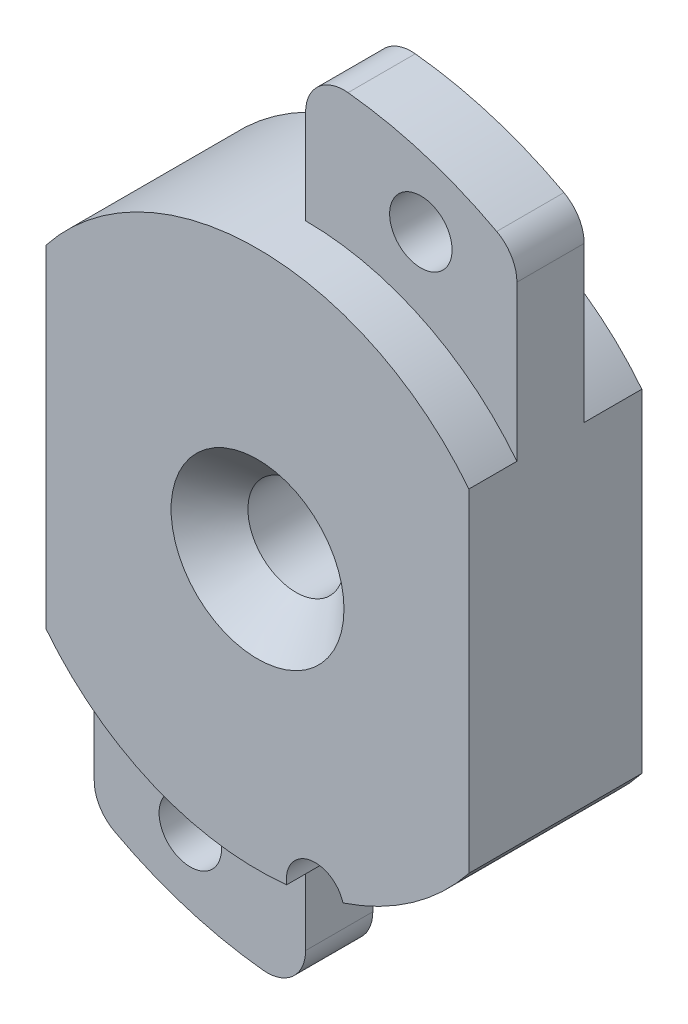
ISO-10303-21;
HEADER;
FILE_DESCRIPTION(('STEP AP214'),'2;1');
FILE_NAME('part.step','',(''),(''),'','','');
FILE_SCHEMA(('AUTOMOTIVE_DESIGN { 1 0 10303 214 1 1 1 1 }'));
ENDSEC;
DATA;
#1=APPLICATION_CONTEXT('core data for automotive mechanical design processes');
#2=APPLICATION_PROTOCOL_DEFINITION('international standard','automotive_design',2000,#1);
#3=PRODUCT_CONTEXT('',#1,'mechanical');
#4=PRODUCT('Part','Part','',(#3));
#5=PRODUCT_RELATED_PRODUCT_CATEGORY('part','',(#4));
#6=PRODUCT_DEFINITION_FORMATION('','',#4);
#7=PRODUCT_DEFINITION_CONTEXT('part definition',#1,'design');
#8=PRODUCT_DEFINITION('design','',#6,#7);
#9=PRODUCT_DEFINITION_SHAPE('','',#8);
#10=(LENGTH_UNIT() NAMED_UNIT(*) SI_UNIT(.MILLI.,.METRE.));
#11=(NAMED_UNIT(*) PLANE_ANGLE_UNIT() SI_UNIT($,.RADIAN.));
#12=(NAMED_UNIT(*) SI_UNIT($,.STERADIAN.) SOLID_ANGLE_UNIT());
#13=UNCERTAINTY_MEASURE_WITH_UNIT(LENGTH_MEASURE(1.E-05),#10,'distance_accuracy_value','');
#14=(GEOMETRIC_REPRESENTATION_CONTEXT(3) GLOBAL_UNCERTAINTY_ASSIGNED_CONTEXT((#13)) GLOBAL_UNIT_ASSIGNED_CONTEXT((#10,
#11,#12)) REPRESENTATION_CONTEXT('',''));
#15=CARTESIAN_POINT('',(0.,0.,0.));
#16=DIRECTION('',(0.,0.,1.));
#17=DIRECTION('',(1.,0.,0.));
#18=AXIS2_PLACEMENT_3D('',#15,#16,#17);
#19=CARTESIAN_POINT('',(0.,0.,6.5));
#20=DIRECTION('',(0.,0.,1.));
#21=DIRECTION('',(-1.,0.,0.));
#22=AXIS2_PLACEMENT_3D('',#19,#20,#21);
#23=PLANE('',#22);
#24=CARTESIAN_POINT('',(0.,0.,6.5));
#25=DIRECTION('',(0.,0.,1.));
#26=DIRECTION('',(1.,0.,0.));
#27=AXIS2_PLACEMENT_3D('',#24,#25,#26);
#28=CIRCLE('',#27,21.);
#29=CARTESIAN_POINT('',(-2.21052631578947,-20.883332430606,6.5));
#30=VERTEX_POINT('',#29);
#31=CARTESIAN_POINT('',(-9.94736842105263,-18.4945900602269,6.5));
#32=VERTEX_POINT('',#31);
#33=EDGE_CURVE('E185',#30,#32,#28,.F.);
#34=ORIENTED_EDGE('',*,*,#33,.F.);
#35=CARTESIAN_POINT('',(-2.,-18.8944436276912,6.5));
#36=DIRECTION('',(0.,0.,1.));
#37=DIRECTION('',(1.,0.,0.));
#38=AXIS2_PLACEMENT_3D('',#35,#36,#37);
#39=CIRCLE('',#38,2.);
#40=CARTESIAN_POINT('',(0.,-18.8944436276912,6.5));
#41=VERTEX_POINT('',#40);
#42=EDGE_CURVE('E295',#30,#41,#39,.T.);
#43=ORIENTED_EDGE('',*,*,#42,.T.);
#44=DIRECTION('',(0.,1.,0.));
#45=VECTOR('',#44,1.);
#46=CARTESIAN_POINT('',(0.,-8.66025403784439,6.5));
#47=LINE('',#46,#45);
#48=CARTESIAN_POINT('',(0.,-14.,6.5));
#49=VERTEX_POINT('',#48);
#50=EDGE_CURVE('E196',#41,#49,#47,.T.);
#51=ORIENTED_EDGE('',*,*,#50,.T.);
#52=CARTESIAN_POINT('',(0.,0.,6.5));
#53=DIRECTION('',(0.,0.,1.));
#54=DIRECTION('',(1.,0.,0.));
#55=AXIS2_PLACEMENT_3D('',#52,#53,#54);
#56=CIRCLE('',#55,14.);
#57=CARTESIAN_POINT('',(-11.,-8.66025403784439,6.5));
#58=VERTEX_POINT('',#57);
#59=EDGE_CURVE('E277',#58,#49,#56,.T.);
#60=ORIENTED_EDGE('',*,*,#59,.F.);
#61=DIRECTION('',(0.,-1.,0.));
#62=VECTOR('',#61,1.);
#63=CARTESIAN_POINT('',(-11.,-8.66025403784439,6.5));
#64=LINE('',#63,#62);
#65=CARTESIAN_POINT('',(-11.,-16.7332005306815,6.5));
#66=VERTEX_POINT('',#65);
#67=EDGE_CURVE('E193',#58,#66,#64,.T.);
#68=ORIENTED_EDGE('',*,*,#67,.T.);
#69=CARTESIAN_POINT('',(-9.,-16.7332005306815,6.5));
#70=DIRECTION('',(0.,0.,1.));
#71=DIRECTION('',(1.,0.,0.));
#72=AXIS2_PLACEMENT_3D('',#69,#70,#71);
#73=CIRCLE('',#72,2.);
#74=EDGE_CURVE('E293',#66,#32,#73,.T.);
#75=ORIENTED_EDGE('',*,*,#74,.T.);
#76=EDGE_LOOP('',(#34,#43,#51,#60,#68,#75));
#77=FACE_BOUND('',#76,.T.);
#78=CARTESIAN_POINT('',(-6.,-16.5,6.5));
#79=DIRECTION('',(0.,0.,1.));
#80=DIRECTION('',(1.,0.,0.));
#81=AXIS2_PLACEMENT_3D('',#78,#79,#80);
#82=CIRCLE('',#81,1.625);
#83=CARTESIAN_POINT('',(-4.375,-16.5,6.5));
#84=VERTEX_POINT('',#83);
#85=EDGE_CURVE('E189',#84,#84,#82,.F.);
#86=ORIENTED_EDGE('',*,*,#85,.T.);
#87=EDGE_LOOP('',(#86));
#88=FACE_BOUND('',#87,.T.);
#89=ADVANCED_FACE('F38',(#77,#88),#23,.T.);
#90=CARTESIAN_POINT('',(0.,0.,3.));
#91=DIRECTION('',(0.,0.,1.));
#92=DIRECTION('',(-1.,0.,0.));
#93=AXIS2_PLACEMENT_3D('',#90,#91,#92);
#94=PLANE('',#93);
#95=DIRECTION('',(0.,1.,0.));
#96=VECTOR('',#95,1.);
#97=CARTESIAN_POINT('',(0.,-8.66025403784439,3.));
#98=LINE('',#97,#96);
#99=CARTESIAN_POINT('',(0.,-18.8944436276912,3.));
#100=VERTEX_POINT('',#99);
#101=CARTESIAN_POINT('',(0.,-14.,3.));
#102=VERTEX_POINT('',#101);
#103=EDGE_CURVE('E197',#100,#102,#98,.T.);
#104=ORIENTED_EDGE('',*,*,#103,.F.);
#105=CARTESIAN_POINT('',(-2.,-18.8944436276912,3.));
#106=DIRECTION('',(0.,0.,1.));
#107=DIRECTION('',(1.,0.,0.));
#108=AXIS2_PLACEMENT_3D('',#105,#106,#107);
#109=CIRCLE('',#108,2.);
#110=CARTESIAN_POINT('',(-2.21052631578947,-20.883332430606,3.));
#111=VERTEX_POINT('',#110);
#112=EDGE_CURVE('E287',#100,#111,#109,.F.);
#113=ORIENTED_EDGE('',*,*,#112,.T.);
#114=CARTESIAN_POINT('',(0.,0.,3.));
#115=DIRECTION('',(0.,0.,1.));
#116=DIRECTION('',(1.,0.,0.));
#117=AXIS2_PLACEMENT_3D('',#114,#115,#116);
#118=CIRCLE('',#117,21.);
#119=CARTESIAN_POINT('',(-9.94736842105263,-18.4945900602269,3.));
#120=VERTEX_POINT('',#119);
#121=EDGE_CURVE('E171',#111,#120,#118,.F.);
#122=ORIENTED_EDGE('',*,*,#121,.T.);
#123=CARTESIAN_POINT('',(-9.,-16.7332005306815,3.));
#124=DIRECTION('',(0.,0.,1.));
#125=DIRECTION('',(1.,0.,0.));
#126=AXIS2_PLACEMENT_3D('',#123,#124,#125);
#127=CIRCLE('',#126,2.);
#128=CARTESIAN_POINT('',(-11.,-16.7332005306815,3.));
#129=VERTEX_POINT('',#128);
#130=EDGE_CURVE('E285',#120,#129,#127,.F.);
#131=ORIENTED_EDGE('',*,*,#130,.T.);
#132=DIRECTION('',(0.,-1.,0.));
#133=VECTOR('',#132,1.);
#134=CARTESIAN_POINT('',(-11.,-8.66025403784439,3.));
#135=LINE('',#134,#133);
#136=CARTESIAN_POINT('',(-11.,-8.66025403784439,3.));
#137=VERTEX_POINT('',#136);
#138=EDGE_CURVE('E192',#137,#129,#135,.T.);
#139=ORIENTED_EDGE('',*,*,#138,.F.);
#140=CARTESIAN_POINT('',(0.,0.,3.));
#141=DIRECTION('',(0.,0.,1.));
#142=DIRECTION('',(1.,0.,0.));
#143=AXIS2_PLACEMENT_3D('',#140,#141,#142);
#144=CIRCLE('',#143,14.);
#145=EDGE_CURVE('E269',#137,#102,#144,.T.);
#146=ORIENTED_EDGE('',*,*,#145,.T.);
#147=EDGE_LOOP('',(#104,#113,#122,#131,#139,#146));
#148=FACE_BOUND('',#147,.T.);
#149=CARTESIAN_POINT('',(-6.,-16.5,3.));
#150=DIRECTION('',(0.,0.,1.));
#151=DIRECTION('',(1.,0.,0.));
#152=AXIS2_PLACEMENT_3D('',#149,#150,#151);
#153=CIRCLE('',#152,1.625);
#154=CARTESIAN_POINT('',(-4.375,-16.5,3.));
#155=VERTEX_POINT('',#154);
#156=EDGE_CURVE('E188',#155,#155,#153,.F.);
#157=ORIENTED_EDGE('',*,*,#156,.F.);
#158=EDGE_LOOP('',(#157));
#159=FACE_BOUND('',#158,.T.);
#160=ADVANCED_FACE('F353',(#148,#159),#94,.F.);
#161=CARTESIAN_POINT('',(0.,0.,6.5));
#162=DIRECTION('',(0.,0.,1.));
#163=DIRECTION('',(1.,0.,0.));
#164=AXIS2_PLACEMENT_3D('',#161,#162,#163);
#165=PLANE('',#164);
#166=DIRECTION('',(0.,1.,0.));
#167=VECTOR('',#166,1.);
#168=CARTESIAN_POINT('',(11.,8.66025403784439,6.5));
#169=LINE('',#168,#167);
#170=CARTESIAN_POINT('',(11.,8.66025403784439,6.5));
#171=VERTEX_POINT('',#170);
#172=CARTESIAN_POINT('',(11.,16.7332005306815,6.5));
#173=VERTEX_POINT('',#172);
#174=EDGE_CURVE('E213',#171,#173,#169,.T.);
#175=ORIENTED_EDGE('',*,*,#174,.T.);
#176=CARTESIAN_POINT('',(9.,16.7332005306815,6.5));
#177=DIRECTION('',(0.,0.,1.));
#178=DIRECTION('',(1.,0.,0.));
#179=AXIS2_PLACEMENT_3D('',#176,#177,#178);
#180=CIRCLE('',#179,2.);
#181=CARTESIAN_POINT('',(9.94736842105263,18.4945900602269,6.5));
#182=VERTEX_POINT('',#181);
#183=EDGE_CURVE('E305',#173,#182,#180,.T.);
#184=ORIENTED_EDGE('',*,*,#183,.T.);
#185=CARTESIAN_POINT('',(0.,0.,6.5));
#186=DIRECTION('',(0.,0.,1.));
#187=DIRECTION('',(1.,0.,0.));
#188=AXIS2_PLACEMENT_3D('',#185,#186,#187);
#189=CIRCLE('',#188,21.);
#190=CARTESIAN_POINT('',(2.21052631578947,20.883332430606,6.5));
#191=VERTEX_POINT('',#190);
#192=EDGE_CURVE('E205',#191,#182,#189,.F.);
#193=ORIENTED_EDGE('',*,*,#192,.F.);
#194=CARTESIAN_POINT('',(2.,18.8944436276912,6.5));
#195=DIRECTION('',(0.,0.,1.));
#196=DIRECTION('',(1.,0.,0.));
#197=AXIS2_PLACEMENT_3D('',#194,#195,#196);
#198=CIRCLE('',#197,2.);
#199=CARTESIAN_POINT('',(0.,18.8944436276912,6.5));
#200=VERTEX_POINT('',#199);
#201=EDGE_CURVE('E303',#191,#200,#198,.T.);
#202=ORIENTED_EDGE('',*,*,#201,.T.);
#203=DIRECTION('',(0.,-1.,0.));
#204=VECTOR('',#203,1.);
#205=CARTESIAN_POINT('',(0.,8.66025403784439,6.5));
#206=LINE('',#205,#204);
#207=CARTESIAN_POINT('',(0.,14.,6.5));
#208=VERTEX_POINT('',#207);
#209=EDGE_CURVE('E216',#200,#208,#206,.T.);
#210=ORIENTED_EDGE('',*,*,#209,.T.);
#211=CARTESIAN_POINT('',(0.,0.,6.5));
#212=DIRECTION('',(0.,0.,1.));
#213=DIRECTION('',(1.,0.,0.));
#214=AXIS2_PLACEMENT_3D('',#211,#212,#213);
#215=CIRCLE('',#214,14.);
#216=EDGE_CURVE('E266',#171,#208,#215,.T.);
#217=ORIENTED_EDGE('',*,*,#216,.F.);
#218=EDGE_LOOP('',(#175,#184,#193,#202,#210,#217));
#219=FACE_BOUND('',#218,.T.);
#220=CARTESIAN_POINT('',(6.,16.5,6.5));
#221=DIRECTION('',(0.,0.,1.));
#222=DIRECTION('',(1.,0.,0.));
#223=AXIS2_PLACEMENT_3D('',#220,#221,#222);
#224=CIRCLE('',#223,1.625);
#225=CARTESIAN_POINT('',(7.625,16.5,6.5));
#226=VERTEX_POINT('',#225);
#227=EDGE_CURVE('E209',#226,#226,#224,.F.);
#228=ORIENTED_EDGE('',*,*,#227,.T.);
#229=EDGE_LOOP('',(#228));
#230=FACE_BOUND('',#229,.T.);
#231=ADVANCED_FACE('F332',(#219,#230),#165,.T.);
#232=CARTESIAN_POINT('',(0.,0.,3.));
#233=DIRECTION('',(0.,0.,1.));
#234=DIRECTION('',(1.,0.,0.));
#235=AXIS2_PLACEMENT_3D('',#232,#233,#234);
#236=PLANE('',#235);
#237=CARTESIAN_POINT('',(0.,0.,3.));
#238=DIRECTION('',(0.,0.,1.));
#239=DIRECTION('',(1.,0.,0.));
#240=AXIS2_PLACEMENT_3D('',#237,#238,#239);
#241=CIRCLE('',#240,21.);
#242=CARTESIAN_POINT('',(2.21052631578947,20.883332430606,3.));
#243=VERTEX_POINT('',#242);
#244=CARTESIAN_POINT('',(9.94736842105263,18.4945900602269,3.));
#245=VERTEX_POINT('',#244);
#246=EDGE_CURVE('E199',#243,#245,#241,.F.);
#247=ORIENTED_EDGE('',*,*,#246,.T.);
#248=CARTESIAN_POINT('',(9.,16.7332005306815,3.));
#249=DIRECTION('',(0.,0.,1.));
#250=DIRECTION('',(1.,0.,0.));
#251=AXIS2_PLACEMENT_3D('',#248,#249,#250);
#252=CIRCLE('',#251,2.);
#253=CARTESIAN_POINT('',(11.,16.7332005306815,3.));
#254=VERTEX_POINT('',#253);
#255=EDGE_CURVE('E312',#245,#254,#252,.F.);
#256=ORIENTED_EDGE('',*,*,#255,.T.);
#257=DIRECTION('',(0.,1.,0.));
#258=VECTOR('',#257,1.);
#259=CARTESIAN_POINT('',(11.,8.66025403784439,3.));
#260=LINE('',#259,#258);
#261=CARTESIAN_POINT('',(11.,8.66025403784439,3.));
#262=VERTEX_POINT('',#261);
#263=EDGE_CURVE('E212',#262,#254,#260,.T.);
#264=ORIENTED_EDGE('',*,*,#263,.F.);
#265=CARTESIAN_POINT('',(0.,0.,3.));
#266=DIRECTION('',(0.,0.,1.));
#267=DIRECTION('',(1.,0.,0.));
#268=AXIS2_PLACEMENT_3D('',#265,#266,#267);
#269=CIRCLE('',#268,14.);
#270=CARTESIAN_POINT('',(0.,14.,3.));
#271=VERTEX_POINT('',#270);
#272=EDGE_CURVE('E260',#262,#271,#269,.T.);
#273=ORIENTED_EDGE('',*,*,#272,.T.);
#274=DIRECTION('',(0.,-1.,0.));
#275=VECTOR('',#274,1.);
#276=CARTESIAN_POINT('',(0.,8.66025403784439,3.));
#277=LINE('',#276,#275);
#278=CARTESIAN_POINT('',(0.,18.8944436276912,3.));
#279=VERTEX_POINT('',#278);
#280=EDGE_CURVE('E217',#279,#271,#277,.T.);
#281=ORIENTED_EDGE('',*,*,#280,.F.);
#282=CARTESIAN_POINT('',(2.,18.8944436276912,3.));
#283=DIRECTION('',(0.,0.,1.));
#284=DIRECTION('',(1.,0.,0.));
#285=AXIS2_PLACEMENT_3D('',#282,#283,#284);
#286=CIRCLE('',#285,2.);
#287=EDGE_CURVE('E61',#279,#243,#286,.F.);
#288=ORIENTED_EDGE('',*,*,#287,.T.);
#289=EDGE_LOOP('',(#247,#256,#264,#273,#281,#288));
#290=FACE_BOUND('',#289,.T.);
#291=CARTESIAN_POINT('',(6.,16.5,3.));
#292=DIRECTION('',(0.,0.,1.));
#293=DIRECTION('',(1.,0.,0.));
#294=AXIS2_PLACEMENT_3D('',#291,#292,#293);
#295=CIRCLE('',#294,1.625);
#296=CARTESIAN_POINT('',(7.625,16.5,3.));
#297=VERTEX_POINT('',#296);
#298=EDGE_CURVE('E208',#297,#297,#295,.F.);
#299=ORIENTED_EDGE('',*,*,#298,.F.);
#300=EDGE_LOOP('',(#299));
#301=FACE_BOUND('',#300,.T.);
#302=ADVANCED_FACE('F320',(#290,#301),#236,.F.);
#303=CARTESIAN_POINT('',(0.,0.,9.));
#304=DIRECTION('',(0.,0.,-1.));
#305=DIRECTION('',(-1.,0.,0.));
#306=AXIS2_PLACEMENT_3D('',#303,#304,#305);
#307=CYLINDRICAL_SURFACE('',#306,14.);
#308=CARTESIAN_POINT('',(0.,0.,6.5));
#309=DIRECTION('',(0.,0.,1.));
#310=DIRECTION('',(1.,0.,0.));
#311=AXIS2_PLACEMENT_3D('',#308,#309,#310);
#312=CIRCLE('',#311,14.);
#313=CARTESIAN_POINT('',(1.51972801224178,-13.9172708089197,6.5));
#314=VERTEX_POINT('',#313);
#315=CARTESIAN_POINT('',(4.44583321224802,-13.2753367960618,6.5));
#316=VERTEX_POINT('',#315);
#317=EDGE_CURVE('E12',#314,#316,#312,.T.);
#318=ORIENTED_EDGE('',*,*,#317,.F.);
#319=DIRECTION('',(0.,0.,1.));
#320=VECTOR('',#319,1.);
#321=CARTESIAN_POINT('',(1.51972801224178,-13.9172708089197,7.75));
#322=LINE('',#321,#320);
#323=CARTESIAN_POINT('',(1.51972801224178,-13.9172708089197,9.));
#324=VERTEX_POINT('',#323);
#325=EDGE_CURVE('E162',#314,#324,#322,.T.);
#326=ORIENTED_EDGE('',*,*,#325,.T.);
#327=CARTESIAN_POINT('',(0.,0.,9.));
#328=DIRECTION('',(0.,0.,1.));
#329=DIRECTION('',(1.,0.,0.));
#330=AXIS2_PLACEMENT_3D('',#327,#328,#329);
#331=CIRCLE('',#330,14.);
#332=CARTESIAN_POINT('',(-11.,-8.66025403784439,9.));
#333=VERTEX_POINT('',#332);
#334=EDGE_CURVE('E246',#333,#324,#331,.T.);
#335=ORIENTED_EDGE('',*,*,#334,.F.);
#336=DIRECTION('',(0.,0.,-1.));
#337=VECTOR('',#336,1.);
#338=CARTESIAN_POINT('',(-11.,-8.66025403784439,9.));
#339=LINE('',#338,#337);
#340=EDGE_CURVE('E235',#333,#58,#339,.T.);
#341=ORIENTED_EDGE('',*,*,#340,.T.);
#342=ORIENTED_EDGE('',*,*,#59,.T.);
#343=DIRECTION('',(0.,0.,-1.));
#344=VECTOR('',#343,1.);
#345=CARTESIAN_POINT('',(0.,-14.,9.));
#346=LINE('',#345,#344);
#347=EDGE_CURVE('E274',#102,#49,#346,.F.);
#348=ORIENTED_EDGE('',*,*,#347,.F.);
#349=ORIENTED_EDGE('',*,*,#145,.F.);
#350=CARTESIAN_POINT('',(-11.,-8.66025403784439,0.));
#351=VERTEX_POINT('',#350);
#352=EDGE_CURVE('E234',#137,#351,#339,.T.);
#353=ORIENTED_EDGE('',*,*,#352,.T.);
#354=CARTESIAN_POINT('',(0.,0.,0.));
#355=DIRECTION('',(0.,0.,1.));
#356=DIRECTION('',(1.,0.,0.));
#357=AXIS2_PLACEMENT_3D('',#354,#355,#356);
#358=CIRCLE('',#357,14.);
#359=CARTESIAN_POINT('',(11.,-8.66025403784439,0.));
#360=VERTEX_POINT('',#359);
#361=EDGE_CURVE('E242',#351,#360,#358,.T.);
#362=ORIENTED_EDGE('',*,*,#361,.T.);
#363=DIRECTION('',(0.,0.,-1.));
#364=VECTOR('',#363,1.);
#365=CARTESIAN_POINT('',(11.,-8.66025403784439,9.));
#366=LINE('',#365,#364);
#367=CARTESIAN_POINT('',(11.,-8.66025403784439,9.));
#368=VERTEX_POINT('',#367);
#369=EDGE_CURVE('E237',#360,#368,#366,.F.);
#370=ORIENTED_EDGE('',*,*,#369,.T.);
#371=CARTESIAN_POINT('',(4.44583321224802,-13.2753367960618,9.));
#372=VERTEX_POINT('',#371);
#373=EDGE_CURVE('E179',#372,#368,#331,.T.);
#374=ORIENTED_EDGE('',*,*,#373,.F.);
#375=DIRECTION('',(0.,0.,1.));
#376=VECTOR('',#375,1.);
#377=CARTESIAN_POINT('',(4.44583321224802,-13.2753367960618,7.75));
#378=LINE('',#377,#376);
#379=EDGE_CURVE('E53',#372,#316,#378,.F.);
#380=ORIENTED_EDGE('',*,*,#379,.T.);
#381=EDGE_LOOP('',(#318,#326,#335,#341,#342,#348,#349,#353,#362,#370,#374,#380));
#382=FACE_BOUND('',#381,.T.);
#383=ADVANCED_FACE('F176',(#382),#307,.T.);
#384=DIRECTION('',(0.,0.,-1.));
#385=VECTOR('',#384,1.);
#386=CARTESIAN_POINT('',(11.,8.66025403784439,9.));
#387=LINE('',#386,#385);
#388=CARTESIAN_POINT('',(11.,8.66025403784439,9.));
#389=VERTEX_POINT('',#388);
#390=EDGE_CURVE('E240',#389,#171,#387,.T.);
#391=ORIENTED_EDGE('',*,*,#390,.T.);
#392=ORIENTED_EDGE('',*,*,#216,.T.);
#393=DIRECTION('',(0.,0.,-1.));
#394=VECTOR('',#393,1.);
#395=CARTESIAN_POINT('',(0.,14.,9.));
#396=LINE('',#395,#394);
#397=EDGE_CURVE('E263',#271,#208,#396,.F.);
#398=ORIENTED_EDGE('',*,*,#397,.F.);
#399=ORIENTED_EDGE('',*,*,#272,.F.);
#400=CARTESIAN_POINT('',(11.,8.66025403784439,0.));
#401=VERTEX_POINT('',#400);
#402=EDGE_CURVE('E239',#262,#401,#387,.T.);
#403=ORIENTED_EDGE('',*,*,#402,.T.);
#404=CARTESIAN_POINT('',(-11.,8.66025403784439,0.));
#405=VERTEX_POINT('',#404);
#406=EDGE_CURVE('E247',#401,#405,#358,.T.);
#407=ORIENTED_EDGE('',*,*,#406,.T.);
#408=DIRECTION('',(0.,0.,-1.));
#409=VECTOR('',#408,1.);
#410=CARTESIAN_POINT('',(-11.,8.66025403784439,9.));
#411=LINE('',#410,#409);
#412=CARTESIAN_POINT('',(-11.,8.66025403784439,9.));
#413=VERTEX_POINT('',#412);
#414=EDGE_CURVE('E231',#405,#413,#411,.F.);
#415=ORIENTED_EDGE('',*,*,#414,.T.);
#416=EDGE_CURVE('E243',#389,#413,#331,.T.);
#417=ORIENTED_EDGE('',*,*,#416,.F.);
#418=EDGE_LOOP('',(#391,#392,#398,#399,#403,#407,#415,#417));
#419=FACE_BOUND('',#418,.T.);
#420=ADVANCED_FACE('F326',(#419),#307,.T.);
#421=CARTESIAN_POINT('',(0.,0.,9.));
#422=DIRECTION('',(0.,0.,1.));
#423=DIRECTION('',(1.,0.,0.));
#424=AXIS2_PLACEMENT_3D('',#421,#422,#423);
#425=PLANE('',#424);
#426=CARTESIAN_POINT('',(3.,-13.6747943311773,9.));
#427=DIRECTION('',(0.,0.,1.));
#428=DIRECTION('',(1.,0.,0.));
#429=AXIS2_PLACEMENT_3D('',#426,#427,#428);
#430=CIRCLE('',#429,1.5);
#431=EDGE_CURVE('E166',#372,#324,#430,.T.);
#432=ORIENTED_EDGE('',*,*,#431,.F.);
#433=ORIENTED_EDGE('',*,*,#373,.T.);
#434=DIRECTION('',(0.,1.,0.));
#435=VECTOR('',#434,1.);
#436=CARTESIAN_POINT('',(11.,-14.,9.));
#437=LINE('',#436,#435);
#438=EDGE_CURVE('E225',#368,#389,#437,.T.);
#439=ORIENTED_EDGE('',*,*,#438,.T.);
#440=ORIENTED_EDGE('',*,*,#416,.T.);
#441=DIRECTION('',(0.,-1.,0.));
#442=VECTOR('',#441,1.);
#443=CARTESIAN_POINT('',(-11.,-14.,9.));
#444=LINE('',#443,#442);
#445=EDGE_CURVE('E228',#413,#333,#444,.T.);
#446=ORIENTED_EDGE('',*,*,#445,.T.);
#447=ORIENTED_EDGE('',*,*,#334,.T.);
#448=EDGE_LOOP('',(#432,#433,#439,#440,#446,#447));
#449=FACE_BOUND('',#448,.T.);
#450=CARTESIAN_POINT('',(0.,0.,9.));
#451=DIRECTION('',(0.,0.,1.));
#452=DIRECTION('',(1.,0.,0.));
#453=AXIS2_PLACEMENT_3D('',#450,#451,#452);
#454=CIRCLE('',#453,4.5);
#455=CARTESIAN_POINT('',(4.5,0.,9.));
#456=VERTEX_POINT('',#455);
#457=EDGE_CURVE('E257',#456,#456,#454,.F.);
#458=ORIENTED_EDGE('',*,*,#457,.T.);
#459=EDGE_LOOP('',(#458));
#460=FACE_BOUND('',#459,.T.);
#461=ADVANCED_FACE('F395',(#449,#460),#425,.T.);
#462=CARTESIAN_POINT('',(0.,0.,0.));
#463=DIRECTION('',(0.,0.,1.));
#464=DIRECTION('',(1.,0.,0.));
#465=AXIS2_PLACEMENT_3D('',#462,#463,#464);
#466=PLANE('',#465);
#467=CARTESIAN_POINT('',(0.,0.,0.));
#468=DIRECTION('',(0.,0.,1.));
#469=DIRECTION('',(1.,0.,0.));
#470=AXIS2_PLACEMENT_3D('',#467,#468,#469);
#471=CIRCLE('',#470,2.5);
#472=CARTESIAN_POINT('',(2.5,0.,0.));
#473=VERTEX_POINT('',#472);
#474=EDGE_CURVE('E219',#473,#473,#471,.T.);
#475=ORIENTED_EDGE('',*,*,#474,.T.);
#476=EDGE_LOOP('',(#475));
#477=FACE_BOUND('',#476,.T.);
#478=ORIENTED_EDGE('',*,*,#406,.F.);
#479=DIRECTION('',(0.,-1.,0.));
#480=VECTOR('',#479,1.);
#481=CARTESIAN_POINT('',(11.,0.,0.));
#482=LINE('',#481,#480);
#483=EDGE_CURVE('E251',#401,#360,#482,.T.);
#484=ORIENTED_EDGE('',*,*,#483,.T.);
#485=ORIENTED_EDGE('',*,*,#361,.F.);
#486=DIRECTION('',(0.,1.,0.));
#487=VECTOR('',#486,1.);
#488=CARTESIAN_POINT('',(-11.,0.,0.));
#489=LINE('',#488,#487);
#490=EDGE_CURVE('E245',#351,#405,#489,.T.);
#491=ORIENTED_EDGE('',*,*,#490,.T.);
#492=EDGE_LOOP('',(#478,#484,#485,#491));
#493=FACE_BOUND('',#492,.T.);
#494=ADVANCED_FACE('F391',(#477,#493),#466,.F.);
#495=CARTESIAN_POINT('',(-11.,-14.,9.));
#496=DIRECTION('',(1.,0.,0.));
#497=DIRECTION('',(0.,0.,-1.));
#498=AXIS2_PLACEMENT_3D('',#495,#496,#497);
#499=PLANE('',#498);
#500=ORIENTED_EDGE('',*,*,#138,.T.);
#501=DIRECTION('',(0.,0.,-1.));
#502=VECTOR('',#501,1.);
#503=CARTESIAN_POINT('',(-11.,-16.7332005306815,9.));
#504=LINE('',#503,#502);
#505=EDGE_CURVE('E297',#129,#66,#504,.F.);
#506=ORIENTED_EDGE('',*,*,#505,.T.);
#507=ORIENTED_EDGE('',*,*,#67,.F.);
#508=ORIENTED_EDGE('',*,*,#340,.F.);
#509=ORIENTED_EDGE('',*,*,#445,.F.);
#510=ORIENTED_EDGE('',*,*,#414,.F.);
#511=ORIENTED_EDGE('',*,*,#490,.F.);
#512=ORIENTED_EDGE('',*,*,#352,.F.);
#513=EDGE_LOOP('',(#500,#506,#507,#508,#509,#510,#511,#512));
#514=FACE_BOUND('',#513,.T.);
#515=ADVANCED_FACE('F388',(#514),#499,.F.);
#516=CARTESIAN_POINT('',(11.,-14.,9.));
#517=DIRECTION('',(-1.,0.,0.));
#518=DIRECTION('',(0.,0.,1.));
#519=AXIS2_PLACEMENT_3D('',#516,#517,#518);
#520=PLANE('',#519);
#521=ORIENTED_EDGE('',*,*,#263,.T.);
#522=DIRECTION('',(0.,0.,-1.));
#523=VECTOR('',#522,1.);
#524=CARTESIAN_POINT('',(11.,16.7332005306815,9.));
#525=LINE('',#524,#523);
#526=EDGE_CURVE('E300',#254,#173,#525,.F.);
#527=ORIENTED_EDGE('',*,*,#526,.T.);
#528=ORIENTED_EDGE('',*,*,#174,.F.);
#529=ORIENTED_EDGE('',*,*,#390,.F.);
#530=ORIENTED_EDGE('',*,*,#438,.F.);
#531=ORIENTED_EDGE('',*,*,#369,.F.);
#532=ORIENTED_EDGE('',*,*,#483,.F.);
#533=ORIENTED_EDGE('',*,*,#402,.F.);
#534=EDGE_LOOP('',(#521,#527,#528,#529,#530,#531,#532,#533));
#535=FACE_BOUND('',#534,.T.);
#536=ADVANCED_FACE('F335',(#535),#520,.F.);
#537=CARTESIAN_POINT('',(0.,0.,0.));
#538=DIRECTION('',(0.,0.,1.));
#539=DIRECTION('',(1.,0.,0.));
#540=AXIS2_PLACEMENT_3D('',#537,#538,#539);
#541=CYLINDRICAL_SURFACE('',#540,2.5);
#542=CARTESIAN_POINT('',(0.,0.,7.00000000000001));
#543=DIRECTION('',(0.,0.,1.));
#544=DIRECTION('',(1.,0.,0.));
#545=AXIS2_PLACEMENT_3D('',#542,#543,#544);
#546=CIRCLE('',#545,2.5);
#547=CARTESIAN_POINT('',(2.5,0.,7.00000000000001));
#548=VERTEX_POINT('',#547);
#549=EDGE_CURVE('E254',#548,#548,#546,.T.);
#550=ORIENTED_EDGE('',*,*,#549,.T.);
#551=EDGE_LOOP('',(#550));
#552=FACE_BOUND('',#551,.T.);
#553=ORIENTED_EDGE('',*,*,#474,.F.);
#554=EDGE_LOOP('',(#553));
#555=FACE_BOUND('',#554,.T.);
#556=ADVANCED_FACE('F384',(#552,#555),#541,.F.);
#557=CARTESIAN_POINT('',(0.,0.,7.00000000000001));
#558=DIRECTION('',(0.,0.,1.));
#559=DIRECTION('',(1.,0.,0.));
#560=AXIS2_PLACEMENT_3D('',#557,#558,#559);
#561=CONICAL_SURFACE('',#560,2.5,0.785398163397451);
#562=ORIENTED_EDGE('',*,*,#457,.F.);
#563=EDGE_LOOP('',(#562));
#564=FACE_BOUND('',#563,.T.);
#565=ORIENTED_EDGE('',*,*,#549,.F.);
#566=EDGE_LOOP('',(#565));
#567=FACE_BOUND('',#566,.T.);
#568=ADVANCED_FACE('F383',(#564,#567),#561,.F.);
#569=CARTESIAN_POINT('',(0.,8.66025403784439,6.5));
#570=DIRECTION('',(1.,0.,0.));
#571=DIRECTION('',(0.,0.,-1.));
#572=AXIS2_PLACEMENT_3D('',#569,#570,#571);
#573=PLANE('',#572);
#574=ORIENTED_EDGE('',*,*,#209,.F.);
#575=DIRECTION('',(0.,0.,-1.));
#576=VECTOR('',#575,1.);
#577=CARTESIAN_POINT('',(0.,18.8944436276912,6.5));
#578=LINE('',#577,#576);
#579=EDGE_CURVE('E46',#200,#279,#578,.T.);
#580=ORIENTED_EDGE('',*,*,#579,.T.);
#581=ORIENTED_EDGE('',*,*,#280,.T.);
#582=ORIENTED_EDGE('',*,*,#397,.T.);
#583=EDGE_LOOP('',(#574,#580,#581,#582));
#584=FACE_BOUND('',#583,.T.);
#585=ADVANCED_FACE('F316',(#584),#573,.F.);
#586=CARTESIAN_POINT('',(6.,16.5,9.));
#587=DIRECTION('',(0.,0.,-1.));
#588=DIRECTION('',(-1.,0.,0.));
#589=AXIS2_PLACEMENT_3D('',#586,#587,#588);
#590=CYLINDRICAL_SURFACE('',#589,1.625);
#591=ORIENTED_EDGE('',*,*,#227,.F.);
#592=EDGE_LOOP('',(#591));
#593=FACE_BOUND('',#592,.T.);
#594=ORIENTED_EDGE('',*,*,#298,.T.);
#595=EDGE_LOOP('',(#594));
#596=FACE_BOUND('',#595,.T.);
#597=ADVANCED_FACE('F373',(#593,#596),#590,.F.);
#598=CARTESIAN_POINT('',(0.,0.,9.));
#599=DIRECTION('',(0.,0.,-1.));
#600=DIRECTION('',(-1.,0.,0.));
#601=AXIS2_PLACEMENT_3D('',#598,#599,#600);
#602=CYLINDRICAL_SURFACE('',#601,21.);
#603=ORIENTED_EDGE('',*,*,#192,.T.);
#604=DIRECTION('',(0.,0.,-1.));
#605=VECTOR('',#604,1.);
#606=CARTESIAN_POINT('',(9.94736842105263,18.4945900602269,9.));
#607=LINE('',#606,#605);
#608=EDGE_CURVE('E309',#182,#245,#607,.T.);
#609=ORIENTED_EDGE('',*,*,#608,.T.);
#610=ORIENTED_EDGE('',*,*,#246,.F.);
#611=DIRECTION('',(0.,0.,-1.));
#612=VECTOR('',#611,1.);
#613=CARTESIAN_POINT('',(2.21052631578947,20.883332430606,9.));
#614=LINE('',#613,#612);
#615=EDGE_CURVE('E307',#243,#191,#614,.F.);
#616=ORIENTED_EDGE('',*,*,#615,.T.);
#617=EDGE_LOOP('',(#603,#609,#610,#616));
#618=FACE_BOUND('',#617,.T.);
#619=ADVANCED_FACE('F344',(#618),#602,.T.);
#620=CARTESIAN_POINT('',(0.,-8.66025403784439,6.5));
#621=DIRECTION('',(-1.,0.,0.));
#622=DIRECTION('',(0.,0.,1.));
#623=AXIS2_PLACEMENT_3D('',#620,#621,#622);
#624=PLANE('',#623);
#625=ORIENTED_EDGE('',*,*,#50,.F.);
#626=DIRECTION('',(0.,0.,-1.));
#627=VECTOR('',#626,1.);
#628=CARTESIAN_POINT('',(0.,-18.8944436276912,6.5));
#629=LINE('',#628,#627);
#630=EDGE_CURVE('E280',#41,#100,#629,.T.);
#631=ORIENTED_EDGE('',*,*,#630,.T.);
#632=ORIENTED_EDGE('',*,*,#103,.T.);
#633=ORIENTED_EDGE('',*,*,#347,.T.);
#634=EDGE_LOOP('',(#625,#631,#632,#633));
#635=FACE_BOUND('',#634,.T.);
#636=ADVANCED_FACE('F367',(#635),#624,.F.);
#637=CARTESIAN_POINT('',(-6.,-16.5,9.));
#638=DIRECTION('',(0.,0.,-1.));
#639=DIRECTION('',(-1.,0.,0.));
#640=AXIS2_PLACEMENT_3D('',#637,#638,#639);
#641=CYLINDRICAL_SURFACE('',#640,1.625);
#642=ORIENTED_EDGE('',*,*,#85,.F.);
#643=EDGE_LOOP('',(#642));
#644=FACE_BOUND('',#643,.T.);
#645=ORIENTED_EDGE('',*,*,#156,.T.);
#646=EDGE_LOOP('',(#645));
#647=FACE_BOUND('',#646,.T.);
#648=ADVANCED_FACE('F364',(#644,#647),#641,.F.);
#649=CARTESIAN_POINT('',(0.,0.,9.));
#650=DIRECTION('',(0.,0.,-1.));
#651=DIRECTION('',(-1.,0.,0.));
#652=AXIS2_PLACEMENT_3D('',#649,#650,#651);
#653=CYLINDRICAL_SURFACE('',#652,21.);
#654=ORIENTED_EDGE('',*,*,#121,.F.);
#655=DIRECTION('',(0.,0.,-1.));
#656=VECTOR('',#655,1.);
#657=CARTESIAN_POINT('',(-2.21052631578947,-20.883332430606,9.));
#658=LINE('',#657,#656);
#659=EDGE_CURVE('E291',#111,#30,#658,.F.);
#660=ORIENTED_EDGE('',*,*,#659,.T.);
#661=ORIENTED_EDGE('',*,*,#33,.T.);
#662=DIRECTION('',(0.,0.,-1.));
#663=VECTOR('',#662,1.);
#664=CARTESIAN_POINT('',(-9.94736842105263,-18.4945900602269,9.));
#665=LINE('',#664,#663);
#666=EDGE_CURVE('E289',#32,#120,#665,.T.);
#667=ORIENTED_EDGE('',*,*,#666,.T.);
#668=EDGE_LOOP('',(#654,#660,#661,#667));
#669=FACE_BOUND('',#668,.T.);
#670=ADVANCED_FACE('F410',(#669),#653,.T.);
#671=CARTESIAN_POINT('',(-2.,-18.8944436276912,9.));
#672=DIRECTION('',(0.,0.,-1.));
#673=DIRECTION('',(-1.,0.,0.));
#674=AXIS2_PLACEMENT_3D('',#671,#672,#673);
#675=CYLINDRICAL_SURFACE('',#674,2.);
#676=ORIENTED_EDGE('',*,*,#42,.F.);
#677=ORIENTED_EDGE('',*,*,#659,.F.);
#678=ORIENTED_EDGE('',*,*,#112,.F.);
#679=ORIENTED_EDGE('',*,*,#630,.F.);
#680=EDGE_LOOP('',(#676,#677,#678,#679));
#681=FACE_BOUND('',#680,.T.);
#682=ADVANCED_FACE('F407',(#681),#675,.T.);
#683=CARTESIAN_POINT('',(-9.,-16.7332005306815,9.));
#684=DIRECTION('',(0.,0.,-1.));
#685=DIRECTION('',(-1.,0.,0.));
#686=AXIS2_PLACEMENT_3D('',#683,#684,#685);
#687=CYLINDRICAL_SURFACE('',#686,2.);
#688=ORIENTED_EDGE('',*,*,#130,.F.);
#689=ORIENTED_EDGE('',*,*,#666,.F.);
#690=ORIENTED_EDGE('',*,*,#74,.F.);
#691=ORIENTED_EDGE('',*,*,#505,.F.);
#692=EDGE_LOOP('',(#688,#689,#690,#691));
#693=FACE_BOUND('',#692,.T.);
#694=ADVANCED_FACE('F351',(#693),#687,.T.);
#695=CARTESIAN_POINT('',(9.,16.7332005306815,9.));
#696=DIRECTION('',(0.,0.,-1.));
#697=DIRECTION('',(-1.,0.,0.));
#698=AXIS2_PLACEMENT_3D('',#695,#696,#697);
#699=CYLINDRICAL_SURFACE('',#698,2.);
#700=ORIENTED_EDGE('',*,*,#255,.F.);
#701=ORIENTED_EDGE('',*,*,#608,.F.);
#702=ORIENTED_EDGE('',*,*,#183,.F.);
#703=ORIENTED_EDGE('',*,*,#526,.F.);
#704=EDGE_LOOP('',(#700,#701,#702,#703));
#705=FACE_BOUND('',#704,.T.);
#706=ADVANCED_FACE('F340',(#705),#699,.T.);
#707=CARTESIAN_POINT('',(2.,18.8944436276912,9.));
#708=DIRECTION('',(0.,0.,-1.));
#709=DIRECTION('',(-1.,0.,0.));
#710=AXIS2_PLACEMENT_3D('',#707,#708,#709);
#711=CYLINDRICAL_SURFACE('',#710,2.);
#712=ORIENTED_EDGE('',*,*,#201,.F.);
#713=ORIENTED_EDGE('',*,*,#615,.F.);
#714=ORIENTED_EDGE('',*,*,#287,.F.);
#715=ORIENTED_EDGE('',*,*,#579,.F.);
#716=EDGE_LOOP('',(#712,#713,#714,#715));
#717=FACE_BOUND('',#716,.T.);
#718=ADVANCED_FACE('F40',(#717),#711,.T.);
#719=CARTESIAN_POINT('',(0.,0.,6.5));
#720=DIRECTION('',(0.,0.,1.));
#721=DIRECTION('',(-1.,0.,0.));
#722=AXIS2_PLACEMENT_3D('',#719,#720,#721);
#723=PLANE('',#722);
#724=ORIENTED_EDGE('',*,*,#317,.T.);
#725=CARTESIAN_POINT('',(3.,-13.6747943311773,6.5));
#726=DIRECTION('',(0.,0.,1.));
#727=DIRECTION('',(1.,0.,0.));
#728=AXIS2_PLACEMENT_3D('',#725,#726,#727);
#729=CIRCLE('',#728,1.5);
#730=EDGE_CURVE('E165',#314,#316,#729,.F.);
#731=ORIENTED_EDGE('',*,*,#730,.F.);
#732=EDGE_LOOP('',(#724,#731));
#733=FACE_BOUND('',#732,.T.);
#734=ADVANCED_FACE('F174',(#733),#723,.T.);
#735=CARTESIAN_POINT('',(3.,-13.6747943311773,2.25735931288071));
#736=DIRECTION('',(0.,0.,1.));
#737=DIRECTION('',(1.,0.,0.));
#738=AXIS2_PLACEMENT_3D('',#735,#736,#737);
#739=CYLINDRICAL_SURFACE('',#738,1.5);
#740=ORIENTED_EDGE('',*,*,#730,.T.);
#741=ORIENTED_EDGE('',*,*,#379,.F.);
#742=ORIENTED_EDGE('',*,*,#431,.T.);
#743=ORIENTED_EDGE('',*,*,#325,.F.);
#744=EDGE_LOOP('',(#740,#741,#742,#743));
#745=FACE_BOUND('',#744,.T.);
#746=ADVANCED_FACE('F164',(#745),#739,.F.);
#747=CLOSED_SHELL('',(#89,#160,#231,#302,#383,#420,#461,#494,#515,#536,#556,#568,#585,#597,#619,
#636,#648,#670,#682,#694,#706,#718,#734,#746));
#748=MANIFOLD_SOLID_BREP('B2',#747);
#749=ADVANCED_BREP_SHAPE_REPRESENTATION('',(#18,#748),#14);
#750=SHAPE_DEFINITION_REPRESENTATION(#9,#749);
ENDSEC;
END-ISO-10303-21;
